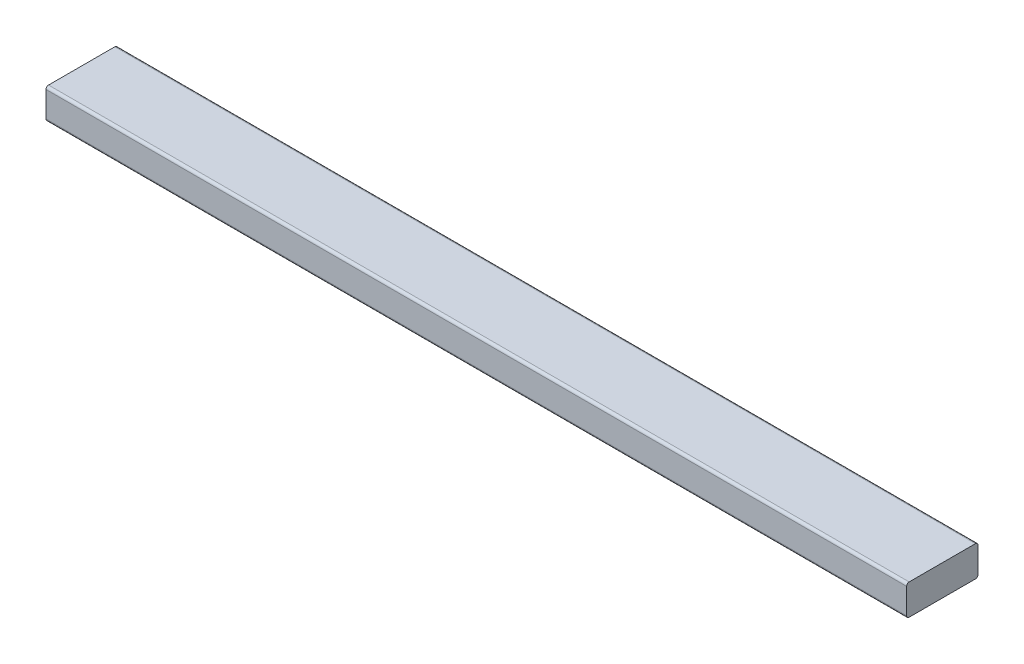
ISO-10303-21;
HEADER;
FILE_DESCRIPTION(('STEP AP214'),'2;1');
FILE_NAME('part.step','',(''),(''),'','','');
FILE_SCHEMA(('AUTOMOTIVE_DESIGN { 1 0 10303 214 1 1 1 1 }'));
ENDSEC;
DATA;
#1=APPLICATION_CONTEXT('core data for automotive mechanical design processes');
#2=APPLICATION_PROTOCOL_DEFINITION('international standard','automotive_design',2000,#1);
#3=PRODUCT_CONTEXT('',#1,'mechanical');
#4=PRODUCT('Part','Part','',(#3));
#5=PRODUCT_RELATED_PRODUCT_CATEGORY('part','',(#4));
#6=PRODUCT_DEFINITION_FORMATION('','',#4);
#7=PRODUCT_DEFINITION_CONTEXT('part definition',#1,'design');
#8=PRODUCT_DEFINITION('design','',#6,#7);
#9=PRODUCT_DEFINITION_SHAPE('','',#8);
#10=(LENGTH_UNIT() NAMED_UNIT(*) SI_UNIT(.MILLI.,.METRE.));
#11=(NAMED_UNIT(*) PLANE_ANGLE_UNIT() SI_UNIT($,.RADIAN.));
#12=(NAMED_UNIT(*) SI_UNIT($,.STERADIAN.) SOLID_ANGLE_UNIT());
#13=UNCERTAINTY_MEASURE_WITH_UNIT(LENGTH_MEASURE(1.E-05),#10,'distance_accuracy_value','');
#14=(GEOMETRIC_REPRESENTATION_CONTEXT(3) GLOBAL_UNCERTAINTY_ASSIGNED_CONTEXT((#13)) GLOBAL_UNIT_ASSIGNED_CONTEXT((#10,
#11,#12)) REPRESENTATION_CONTEXT('',''));
#15=CARTESIAN_POINT('',(0.,0.,0.));
#16=DIRECTION('',(0.,0.,1.));
#17=DIRECTION('',(1.,0.,0.));
#18=AXIS2_PLACEMENT_3D('',#15,#16,#17);
#19=CARTESIAN_POINT('',(-535.78125,38.1,88.9));
#20=DIRECTION('',(1.,0.,0.));
#21=DIRECTION('',(0.,0.,-1.));
#22=AXIS2_PLACEMENT_3D('',#19,#20,#21);
#23=PLANE('',#22);
#24=DIRECTION('',(0.,-1.,0.));
#25=VECTOR('',#24,1.);
#26=CARTESIAN_POINT('',(-535.78125,38.1,0.));
#27=LINE('',#26,#25);
#28=CARTESIAN_POINT('',(-535.78125,34.925,0.));
#29=VERTEX_POINT('',#28);
#30=CARTESIAN_POINT('',(-535.78125,3.17500000000001,0.));
#31=VERTEX_POINT('',#30);
#32=EDGE_CURVE('E166',#29,#31,#27,.T.);
#33=ORIENTED_EDGE('',*,*,#32,.T.);
#34=CARTESIAN_POINT('',(-535.78125,3.175,3.175));
#35=DIRECTION('',(1.,0.,0.));
#36=DIRECTION('',(0.,0.,-1.));
#37=AXIS2_PLACEMENT_3D('',#34,#35,#36);
#38=CIRCLE('',#37,3.175);
#39=CARTESIAN_POINT('',(-535.78125,0.,3.175));
#40=VERTEX_POINT('',#39);
#41=EDGE_CURVE('E140',#31,#40,#38,.F.);
#42=ORIENTED_EDGE('',*,*,#41,.T.);
#43=DIRECTION('',(0.,0.,-1.));
#44=VECTOR('',#43,1.);
#45=CARTESIAN_POINT('',(-535.78125,0.,88.9));
#46=LINE('',#45,#44);
#47=CARTESIAN_POINT('',(-535.78125,0.,85.725));
#48=VERTEX_POINT('',#47);
#49=EDGE_CURVE('E119',#48,#40,#46,.T.);
#50=ORIENTED_EDGE('',*,*,#49,.F.);
#51=CARTESIAN_POINT('',(-535.78125,3.175,85.725));
#52=DIRECTION('',(1.,0.,0.));
#53=DIRECTION('',(0.,0.,-1.));
#54=AXIS2_PLACEMENT_3D('',#51,#52,#53);
#55=CIRCLE('',#54,3.175);
#56=CARTESIAN_POINT('',(-535.78125,3.17500000000001,88.9));
#57=VERTEX_POINT('',#56);
#58=EDGE_CURVE('E124',#48,#57,#55,.F.);
#59=ORIENTED_EDGE('',*,*,#58,.T.);
#60=DIRECTION('',(0.,-1.,0.));
#61=VECTOR('',#60,1.);
#62=CARTESIAN_POINT('',(-535.78125,38.1,88.9));
#63=LINE('',#62,#61);
#64=CARTESIAN_POINT('',(-535.78125,34.925,88.9));
#65=VERTEX_POINT('',#64);
#66=EDGE_CURVE('E161',#65,#57,#63,.T.);
#67=ORIENTED_EDGE('',*,*,#66,.F.);
#68=CARTESIAN_POINT('',(-535.78125,34.925,85.725));
#69=DIRECTION('',(1.,0.,0.));
#70=DIRECTION('',(0.,0.,-1.));
#71=AXIS2_PLACEMENT_3D('',#68,#69,#70);
#72=CIRCLE('',#71,3.175);
#73=CARTESIAN_POINT('',(-535.78125,38.1,85.725));
#74=VERTEX_POINT('',#73);
#75=EDGE_CURVE('E54',#65,#74,#72,.F.);
#76=ORIENTED_EDGE('',*,*,#75,.T.);
#77=DIRECTION('',(0.,0.,-1.));
#78=VECTOR('',#77,1.);
#79=CARTESIAN_POINT('',(-535.78125,38.1,88.9));
#80=LINE('',#79,#78);
#81=CARTESIAN_POINT('',(-535.78125,38.1,3.175));
#82=VERTEX_POINT('',#81);
#83=EDGE_CURVE('E151',#74,#82,#80,.T.);
#84=ORIENTED_EDGE('',*,*,#83,.T.);
#85=CARTESIAN_POINT('',(-535.78125,34.925,3.175));
#86=DIRECTION('',(1.,0.,0.));
#87=DIRECTION('',(0.,0.,-1.));
#88=AXIS2_PLACEMENT_3D('',#85,#86,#87);
#89=CIRCLE('',#88,3.175);
#90=EDGE_CURVE('E47',#82,#29,#89,.F.);
#91=ORIENTED_EDGE('',*,*,#90,.T.);
#92=EDGE_LOOP('',(#33,#42,#50,#59,#67,#76,#84,#91));
#93=FACE_BOUND('',#92,.T.);
#94=ADVANCED_FACE('F32',(#93),#23,.F.);
#95=CARTESIAN_POINT('',(-535.78125,0.,88.9));
#96=DIRECTION('',(0.,1.,0.));
#97=DIRECTION('',(-1.,0.,0.));
#98=AXIS2_PLACEMENT_3D('',#95,#96,#97);
#99=PLANE('',#98);
#100=ORIENTED_EDGE('',*,*,#49,.T.);
#101=DIRECTION('',(1.,0.,0.));
#102=VECTOR('',#101,1.);
#103=CARTESIAN_POINT('',(-535.78125,0.,3.175));
#104=LINE('',#103,#102);
#105=CARTESIAN_POINT('',(535.78125,1.968428378567E-13,3.175));
#106=VERTEX_POINT('',#105);
#107=EDGE_CURVE('E118',#40,#106,#104,.T.);
#108=ORIENTED_EDGE('',*,*,#107,.T.);
#109=DIRECTION('',(0.,0.,-1.));
#110=VECTOR('',#109,1.);
#111=CARTESIAN_POINT('',(535.78125,1.968428378567E-13,88.9));
#112=LINE('',#111,#110);
#113=CARTESIAN_POINT('',(535.78125,1.968428378567E-13,85.725));
#114=VERTEX_POINT('',#113);
#115=EDGE_CURVE('E101',#114,#106,#112,.T.);
#116=ORIENTED_EDGE('',*,*,#115,.F.);
#117=DIRECTION('',(1.,0.,0.));
#118=VECTOR('',#117,1.);
#119=CARTESIAN_POINT('',(-535.78125,0.,85.725));
#120=LINE('',#119,#118);
#121=EDGE_CURVE('E115',#114,#48,#120,.F.);
#122=ORIENTED_EDGE('',*,*,#121,.T.);
#123=EDGE_LOOP('',(#100,#108,#116,#122));
#124=FACE_BOUND('',#123,.T.);
#125=ADVANCED_FACE('F114',(#124),#99,.F.);
#126=CARTESIAN_POINT('',(535.78125,38.1000000000002,88.9));
#127=DIRECTION('',(-1.,0.,0.));
#128=DIRECTION('',(0.,0.,1.));
#129=AXIS2_PLACEMENT_3D('',#126,#127,#128);
#130=PLANE('',#129);
#131=ORIENTED_EDGE('',*,*,#115,.T.);
#132=CARTESIAN_POINT('',(535.78125,3.1750000000002,3.175));
#133=DIRECTION('',(-1.,0.,0.));
#134=DIRECTION('',(0.,0.,1.));
#135=AXIS2_PLACEMENT_3D('',#132,#133,#134);
#136=CIRCLE('',#135,3.175);
#137=CARTESIAN_POINT('',(535.78125,3.17500000000021,0.));
#138=VERTEX_POINT('',#137);
#139=EDGE_CURVE('E108',#106,#138,#136,.F.);
#140=ORIENTED_EDGE('',*,*,#139,.T.);
#141=DIRECTION('',(0.,1.,0.));
#142=VECTOR('',#141,1.);
#143=CARTESIAN_POINT('',(535.78125,38.1000000000002,0.));
#144=LINE('',#143,#142);
#145=CARTESIAN_POINT('',(535.78125,34.9250000000002,0.));
#146=VERTEX_POINT('',#145);
#147=EDGE_CURVE('E163',#138,#146,#144,.T.);
#148=ORIENTED_EDGE('',*,*,#147,.T.);
#149=CARTESIAN_POINT('',(535.78125,34.9250000000002,3.175));
#150=DIRECTION('',(-1.,0.,0.));
#151=DIRECTION('',(0.,0.,1.));
#152=AXIS2_PLACEMENT_3D('',#149,#150,#151);
#153=CIRCLE('',#152,3.175);
#154=CARTESIAN_POINT('',(535.78125,38.1000000000002,3.175));
#155=VERTEX_POINT('',#154);
#156=EDGE_CURVE('E109',#146,#155,#153,.F.);
#157=ORIENTED_EDGE('',*,*,#156,.T.);
#158=DIRECTION('',(0.,0.,-1.));
#159=VECTOR('',#158,1.);
#160=CARTESIAN_POINT('',(535.78125,38.1000000000002,88.9));
#161=LINE('',#160,#159);
#162=CARTESIAN_POINT('',(535.78125,38.1000000000002,85.725));
#163=VERTEX_POINT('',#162);
#164=EDGE_CURVE('E120',#163,#155,#161,.T.);
#165=ORIENTED_EDGE('',*,*,#164,.F.);
#166=CARTESIAN_POINT('',(535.78125,34.9250000000002,85.725));
#167=DIRECTION('',(-1.,0.,0.));
#168=DIRECTION('',(0.,0.,1.));
#169=AXIS2_PLACEMENT_3D('',#166,#167,#168);
#170=CIRCLE('',#169,3.175);
#171=CARTESIAN_POINT('',(535.78125,34.9250000000002,88.9));
#172=VERTEX_POINT('',#171);
#173=EDGE_CURVE('E126',#163,#172,#170,.F.);
#174=ORIENTED_EDGE('',*,*,#173,.T.);
#175=DIRECTION('',(0.,1.,0.));
#176=VECTOR('',#175,1.);
#177=CARTESIAN_POINT('',(535.78125,38.1000000000002,88.9));
#178=LINE('',#177,#176);
#179=CARTESIAN_POINT('',(535.78125,3.17500000000021,88.9));
#180=VERTEX_POINT('',#179);
#181=EDGE_CURVE('E103',#180,#172,#178,.T.);
#182=ORIENTED_EDGE('',*,*,#181,.F.);
#183=CARTESIAN_POINT('',(535.78125,3.1750000000002,85.725));
#184=DIRECTION('',(-1.,0.,0.));
#185=DIRECTION('',(0.,0.,1.));
#186=AXIS2_PLACEMENT_3D('',#183,#184,#185);
#187=CIRCLE('',#186,3.175);
#188=EDGE_CURVE('E98',#180,#114,#187,.F.);
#189=ORIENTED_EDGE('',*,*,#188,.T.);
#190=EDGE_LOOP('',(#131,#140,#148,#157,#165,#174,#182,#189));
#191=FACE_BOUND('',#190,.T.);
#192=ADVANCED_FACE('F100',(#191),#130,.F.);
#193=CARTESIAN_POINT('',(-535.78125,38.1,88.9));
#194=DIRECTION('',(0.,-1.,0.));
#195=DIRECTION('',(1.,0.,0.));
#196=AXIS2_PLACEMENT_3D('',#193,#194,#195);
#197=PLANE('',#196);
#198=ORIENTED_EDGE('',*,*,#164,.T.);
#199=DIRECTION('',(-1.,0.,0.));
#200=VECTOR('',#199,1.);
#201=CARTESIAN_POINT('',(-535.78125,38.1,3.175));
#202=LINE('',#201,#200);
#203=EDGE_CURVE('E11',#155,#82,#202,.T.);
#204=ORIENTED_EDGE('',*,*,#203,.T.);
#205=ORIENTED_EDGE('',*,*,#83,.F.);
#206=DIRECTION('',(-1.,0.,0.));
#207=VECTOR('',#206,1.);
#208=CARTESIAN_POINT('',(535.78125,38.1000000000002,85.725));
#209=LINE('',#208,#207);
#210=EDGE_CURVE('E40',#74,#163,#209,.F.);
#211=ORIENTED_EDGE('',*,*,#210,.T.);
#212=EDGE_LOOP('',(#198,#204,#205,#211));
#213=FACE_BOUND('',#212,.T.);
#214=ADVANCED_FACE('F150',(#213),#197,.F.);
#215=CARTESIAN_POINT('',(0.,0.,88.9));
#216=DIRECTION('',(0.,0.,1.));
#217=DIRECTION('',(1.,0.,0.));
#218=AXIS2_PLACEMENT_3D('',#215,#216,#217);
#219=PLANE('',#218);
#220=ORIENTED_EDGE('',*,*,#66,.T.);
#221=DIRECTION('',(1.,0.,0.));
#222=VECTOR('',#221,1.);
#223=CARTESIAN_POINT('',(535.78125,3.1750000000002,88.9));
#224=LINE('',#223,#222);
#225=EDGE_CURVE('E145',#57,#180,#224,.T.);
#226=ORIENTED_EDGE('',*,*,#225,.T.);
#227=ORIENTED_EDGE('',*,*,#181,.T.);
#228=DIRECTION('',(-1.,0.,0.));
#229=VECTOR('',#228,1.);
#230=CARTESIAN_POINT('',(-535.78125,34.925,88.9));
#231=LINE('',#230,#229);
#232=EDGE_CURVE('E142',#172,#65,#231,.T.);
#233=ORIENTED_EDGE('',*,*,#232,.T.);
#234=EDGE_LOOP('',(#220,#226,#227,#233));
#235=FACE_BOUND('',#234,.T.);
#236=ADVANCED_FACE('F160',(#235),#219,.T.);
#237=CARTESIAN_POINT('',(0.,0.,0.));
#238=DIRECTION('',(0.,0.,1.));
#239=DIRECTION('',(1.,0.,0.));
#240=AXIS2_PLACEMENT_3D('',#237,#238,#239);
#241=PLANE('',#240);
#242=ORIENTED_EDGE('',*,*,#147,.F.);
#243=DIRECTION('',(1.,0.,0.));
#244=VECTOR('',#243,1.);
#245=CARTESIAN_POINT('',(0.,3.1750000000001,0.));
#246=LINE('',#245,#244);
#247=EDGE_CURVE('E135',#138,#31,#246,.F.);
#248=ORIENTED_EDGE('',*,*,#247,.T.);
#249=ORIENTED_EDGE('',*,*,#32,.F.);
#250=DIRECTION('',(-1.,0.,0.));
#251=VECTOR('',#250,1.);
#252=CARTESIAN_POINT('',(0.,34.9250000000001,0.));
#253=LINE('',#252,#251);
#254=EDGE_CURVE('E133',#29,#146,#253,.F.);
#255=ORIENTED_EDGE('',*,*,#254,.T.);
#256=EDGE_LOOP('',(#242,#248,#249,#255));
#257=FACE_BOUND('',#256,.T.);
#258=ADVANCED_FACE('F174',(#257),#241,.F.);
#259=CARTESIAN_POINT('',(-535.78125,3.175,3.175));
#260=DIRECTION('',(1.,0.,0.));
#261=DIRECTION('',(0.,1.,0.));
#262=AXIS2_PLACEMENT_3D('',#259,#260,#261);
#263=CYLINDRICAL_SURFACE('',#262,3.175);
#264=ORIENTED_EDGE('',*,*,#41,.F.);
#265=ORIENTED_EDGE('',*,*,#247,.F.);
#266=ORIENTED_EDGE('',*,*,#139,.F.);
#267=ORIENTED_EDGE('',*,*,#107,.F.);
#268=EDGE_LOOP('',(#264,#265,#266,#267));
#269=FACE_BOUND('',#268,.T.);
#270=ADVANCED_FACE('F182',(#269),#263,.T.);
#271=CARTESIAN_POINT('',(0.,3.1750000000001,85.725));
#272=DIRECTION('',(-1.,0.,0.));
#273=DIRECTION('',(0.,-1.,0.));
#274=AXIS2_PLACEMENT_3D('',#271,#272,#273);
#275=CYLINDRICAL_SURFACE('',#274,3.175);
#276=ORIENTED_EDGE('',*,*,#58,.F.);
#277=ORIENTED_EDGE('',*,*,#121,.F.);
#278=ORIENTED_EDGE('',*,*,#188,.F.);
#279=ORIENTED_EDGE('',*,*,#225,.F.);
#280=EDGE_LOOP('',(#276,#277,#278,#279));
#281=FACE_BOUND('',#280,.T.);
#282=ADVANCED_FACE('F123',(#281),#275,.T.);
#283=CARTESIAN_POINT('',(-535.78125,34.925,3.175));
#284=DIRECTION('',(-1.,0.,0.));
#285=DIRECTION('',(0.,-1.,0.));
#286=AXIS2_PLACEMENT_3D('',#283,#284,#285);
#287=CYLINDRICAL_SURFACE('',#286,3.175);
#288=ORIENTED_EDGE('',*,*,#156,.F.);
#289=ORIENTED_EDGE('',*,*,#254,.F.);
#290=ORIENTED_EDGE('',*,*,#90,.F.);
#291=ORIENTED_EDGE('',*,*,#203,.F.);
#292=EDGE_LOOP('',(#288,#289,#290,#291));
#293=FACE_BOUND('',#292,.T.);
#294=ADVANCED_FACE('F176',(#293),#287,.T.);
#295=CARTESIAN_POINT('',(0.,34.9250000000001,85.725));
#296=DIRECTION('',(1.,0.,0.));
#297=DIRECTION('',(0.,1.,0.));
#298=AXIS2_PLACEMENT_3D('',#295,#296,#297);
#299=CYLINDRICAL_SURFACE('',#298,3.175);
#300=ORIENTED_EDGE('',*,*,#173,.F.);
#301=ORIENTED_EDGE('',*,*,#210,.F.);
#302=ORIENTED_EDGE('',*,*,#75,.F.);
#303=ORIENTED_EDGE('',*,*,#232,.F.);
#304=EDGE_LOOP('',(#300,#301,#302,#303));
#305=FACE_BOUND('',#304,.T.);
#306=ADVANCED_FACE('F34',(#305),#299,.T.);
#307=CLOSED_SHELL('',(#94,#125,#192,#214,#236,#258,#270,#282,#294,#306));
#308=MANIFOLD_SOLID_BREP('B2',#307);
#309=ADVANCED_BREP_SHAPE_REPRESENTATION('',(#18,#308),#14);
#310=SHAPE_DEFINITION_REPRESENTATION(#9,#309);
ENDSEC;
END-ISO-10303-21;
